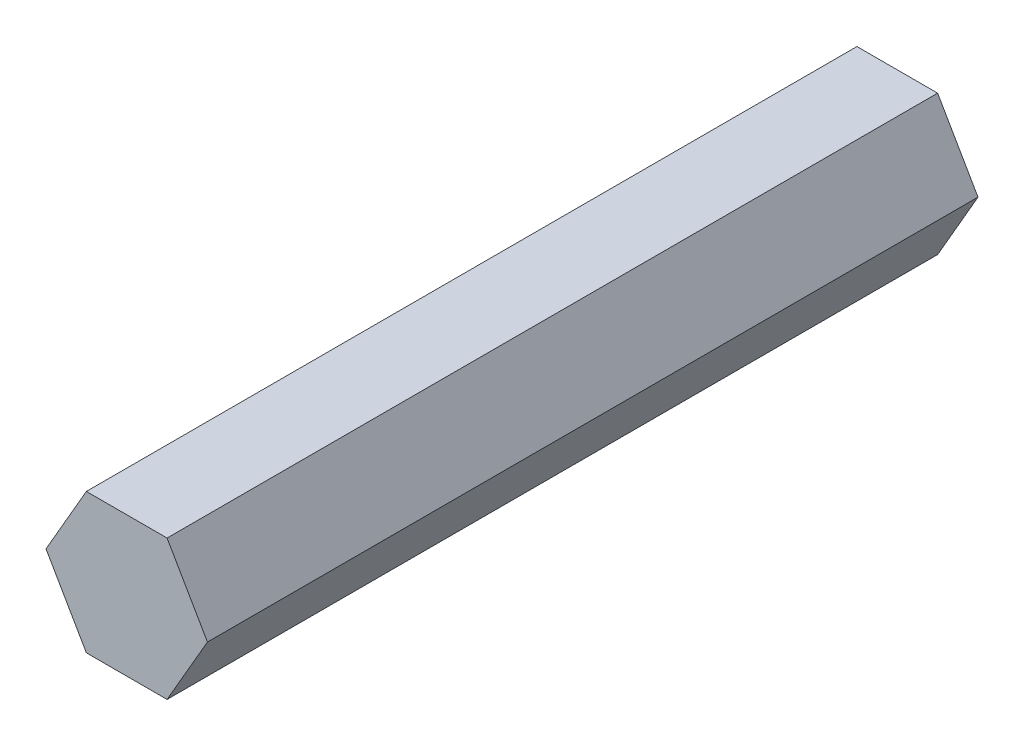
ISO-10303-21;
HEADER;
FILE_DESCRIPTION(('STEP AP214'),'2;1');
FILE_NAME('part.step','',(''),(''),'','','');
FILE_SCHEMA(('AUTOMOTIVE_DESIGN { 1 0 10303 214 1 1 1 1 }'));
ENDSEC;
DATA;
#1=APPLICATION_CONTEXT('core data for automotive mechanical design processes');
#2=APPLICATION_PROTOCOL_DEFINITION('international standard','automotive_design',2000,#1);
#3=PRODUCT_CONTEXT('',#1,'mechanical');
#4=PRODUCT('Part','Part','',(#3));
#5=PRODUCT_RELATED_PRODUCT_CATEGORY('part','',(#4));
#6=PRODUCT_DEFINITION_FORMATION('','',#4);
#7=PRODUCT_DEFINITION_CONTEXT('part definition',#1,'design');
#8=PRODUCT_DEFINITION('design','',#6,#7);
#9=PRODUCT_DEFINITION_SHAPE('','',#8);
#10=(LENGTH_UNIT() NAMED_UNIT(*) SI_UNIT(.MILLI.,.METRE.));
#11=(NAMED_UNIT(*) PLANE_ANGLE_UNIT() SI_UNIT($,.RADIAN.));
#12=(NAMED_UNIT(*) SI_UNIT($,.STERADIAN.) SOLID_ANGLE_UNIT());
#13=UNCERTAINTY_MEASURE_WITH_UNIT(LENGTH_MEASURE(1.E-05),#10,'distance_accuracy_value','');
#14=(GEOMETRIC_REPRESENTATION_CONTEXT(3) GLOBAL_UNCERTAINTY_ASSIGNED_CONTEXT((#13)) GLOBAL_UNIT_ASSIGNED_CONTEXT((#10,
#11,#12)) REPRESENTATION_CONTEXT('',''));
#15=CARTESIAN_POINT('',(0.,0.,0.));
#16=DIRECTION('',(0.,0.,1.));
#17=DIRECTION('',(1.,0.,0.));
#18=AXIS2_PLACEMENT_3D('',#15,#16,#17);
#19=CARTESIAN_POINT('',(3.6661742093542,-6.34999999999996,70.));
#20=DIRECTION('',(-0.866025403784441,0.499999999999995,0.));
#21=DIRECTION('',(-0.499999999999995,-0.866025403784441,0.));
#22=AXIS2_PLACEMENT_3D('',#19,#20,#21);
#23=PLANE('',#22);
#24=DIRECTION('',(0.499999999999995,0.866025403784441,0.));
#25=VECTOR('',#24,1.);
#26=CARTESIAN_POINT('',(3.6661742093542,-6.34999999999996,0.));
#27=LINE('',#26,#25);
#28=CARTESIAN_POINT('',(3.6661742093542,-6.34999999999996,0.));
#29=VERTEX_POINT('',#28);
#30=CARTESIAN_POINT('',(7.33234841870825,0.,0.));
#31=VERTEX_POINT('',#30);
#32=EDGE_CURVE('E124',#29,#31,#27,.T.);
#33=ORIENTED_EDGE('',*,*,#32,.T.);
#34=DIRECTION('',(0.,0.,-1.));
#35=VECTOR('',#34,1.);
#36=CARTESIAN_POINT('',(7.33234841870825,0.,70.));
#37=LINE('',#36,#35);
#38=CARTESIAN_POINT('',(7.33234841870825,0.,70.));
#39=VERTEX_POINT('',#38);
#40=EDGE_CURVE('E11',#39,#31,#37,.T.);
#41=ORIENTED_EDGE('',*,*,#40,.F.);
#42=DIRECTION('',(0.499999999999995,0.866025403784441,0.));
#43=VECTOR('',#42,1.);
#44=CARTESIAN_POINT('',(3.6661742093542,-6.34999999999996,70.));
#45=LINE('',#44,#43);
#46=CARTESIAN_POINT('',(3.6661742093542,-6.34999999999996,70.));
#47=VERTEX_POINT('',#46);
#48=EDGE_CURVE('E134',#47,#39,#45,.T.);
#49=ORIENTED_EDGE('',*,*,#48,.F.);
#50=DIRECTION('',(0.,0.,-1.));
#51=VECTOR('',#50,1.);
#52=CARTESIAN_POINT('',(3.6661742093542,-6.34999999999996,70.));
#53=LINE('',#52,#51);
#54=EDGE_CURVE('E116',#47,#29,#53,.T.);
#55=ORIENTED_EDGE('',*,*,#54,.T.);
#56=EDGE_LOOP('',(#33,#41,#49,#55));
#57=FACE_BOUND('',#56,.T.);
#58=ADVANCED_FACE('F39',(#57),#23,.F.);
#59=CARTESIAN_POINT('',(7.33234841870825,0.,70.));
#60=DIRECTION('',(-0.866025403784438,-0.500000000000001,0.));
#61=DIRECTION('',(0.500000000000001,-0.866025403784438,0.));
#62=AXIS2_PLACEMENT_3D('',#59,#60,#61);
#63=PLANE('',#62);
#64=DIRECTION('',(-0.500000000000001,0.866025403784438,0.));
#65=VECTOR('',#64,1.);
#66=CARTESIAN_POINT('',(7.33234841870825,0.,0.));
#67=LINE('',#66,#65);
#68=CARTESIAN_POINT('',(3.66617420935411,6.35000000000001,0.));
#69=VERTEX_POINT('',#68);
#70=EDGE_CURVE('E127',#31,#69,#67,.T.);
#71=ORIENTED_EDGE('',*,*,#70,.T.);
#72=DIRECTION('',(0.,0.,-1.));
#73=VECTOR('',#72,1.);
#74=CARTESIAN_POINT('',(3.66617420935411,6.35000000000001,70.));
#75=LINE('',#74,#73);
#76=CARTESIAN_POINT('',(3.66617420935411,6.35000000000001,70.));
#77=VERTEX_POINT('',#76);
#78=EDGE_CURVE('E50',#77,#69,#75,.T.);
#79=ORIENTED_EDGE('',*,*,#78,.F.);
#80=DIRECTION('',(-0.500000000000001,0.866025403784438,0.));
#81=VECTOR('',#80,1.);
#82=CARTESIAN_POINT('',(7.33234841870825,0.,70.));
#83=LINE('',#82,#81);
#84=EDGE_CURVE('E95',#39,#77,#83,.T.);
#85=ORIENTED_EDGE('',*,*,#84,.F.);
#86=ORIENTED_EDGE('',*,*,#40,.T.);
#87=EDGE_LOOP('',(#71,#79,#85,#86));
#88=FACE_BOUND('',#87,.T.);
#89=ADVANCED_FACE('F160',(#88),#63,.F.);
#90=CARTESIAN_POINT('',(3.66617420935411,6.35000000000001,70.));
#91=DIRECTION('',(0.,-1.,0.));
#92=DIRECTION('',(1.,0.,0.));
#93=AXIS2_PLACEMENT_3D('',#90,#91,#92);
#94=PLANE('',#93);
#95=DIRECTION('',(-1.,0.,0.));
#96=VECTOR('',#95,1.);
#97=CARTESIAN_POINT('',(3.66617420935411,6.35000000000001,0.));
#98=LINE('',#97,#96);
#99=CARTESIAN_POINT('',(-3.66617420935416,6.34999999999999,0.));
#100=VERTEX_POINT('',#99);
#101=EDGE_CURVE('E126',#69,#100,#98,.T.);
#102=ORIENTED_EDGE('',*,*,#101,.T.);
#103=DIRECTION('',(0.,0.,-1.));
#104=VECTOR('',#103,1.);
#105=CARTESIAN_POINT('',(-3.66617420935416,6.34999999999999,70.));
#106=LINE('',#105,#104);
#107=CARTESIAN_POINT('',(-3.66617420935416,6.34999999999999,70.));
#108=VERTEX_POINT('',#107);
#109=EDGE_CURVE('E111',#108,#100,#106,.T.);
#110=ORIENTED_EDGE('',*,*,#109,.F.);
#111=DIRECTION('',(-1.,0.,0.));
#112=VECTOR('',#111,1.);
#113=CARTESIAN_POINT('',(3.66617420935411,6.35000000000001,70.));
#114=LINE('',#113,#112);
#115=EDGE_CURVE('E104',#77,#108,#114,.T.);
#116=ORIENTED_EDGE('',*,*,#115,.F.);
#117=ORIENTED_EDGE('',*,*,#78,.T.);
#118=EDGE_LOOP('',(#102,#110,#116,#117));
#119=FACE_BOUND('',#118,.T.);
#120=ADVANCED_FACE('F138',(#119),#94,.F.);
#121=CARTESIAN_POINT('',(-3.66617420935416,6.34999999999999,70.));
#122=DIRECTION('',(0.866025403784442,-0.499999999999995,0.));
#123=DIRECTION('',(0.499999999999995,0.866025403784442,0.));
#124=AXIS2_PLACEMENT_3D('',#121,#122,#123);
#125=PLANE('',#124);
#126=DIRECTION('',(-0.499999999999995,-0.866025403784441,0.));
#127=VECTOR('',#126,1.);
#128=CARTESIAN_POINT('',(-3.66617420935416,6.34999999999999,0.));
#129=LINE('',#128,#127);
#130=CARTESIAN_POINT('',(-7.33234841870825,0.,0.));
#131=VERTEX_POINT('',#130);
#132=EDGE_CURVE('E114',#100,#131,#129,.T.);
#133=ORIENTED_EDGE('',*,*,#132,.T.);
#134=DIRECTION('',(0.,0.,-1.));
#135=VECTOR('',#134,1.);
#136=CARTESIAN_POINT('',(-7.33234841870825,0.,70.));
#137=LINE('',#136,#135);
#138=CARTESIAN_POINT('',(-7.33234841870825,0.,70.));
#139=VERTEX_POINT('',#138);
#140=EDGE_CURVE('E109',#139,#131,#137,.T.);
#141=ORIENTED_EDGE('',*,*,#140,.F.);
#142=DIRECTION('',(-0.499999999999995,-0.866025403784441,0.));
#143=VECTOR('',#142,1.);
#144=CARTESIAN_POINT('',(-3.66617420935416,6.34999999999999,70.));
#145=LINE('',#144,#143);
#146=EDGE_CURVE('E97',#108,#139,#145,.T.);
#147=ORIENTED_EDGE('',*,*,#146,.F.);
#148=ORIENTED_EDGE('',*,*,#109,.T.);
#149=EDGE_LOOP('',(#133,#141,#147,#148));
#150=FACE_BOUND('',#149,.T.);
#151=ADVANCED_FACE('F112',(#150),#125,.F.);
#152=CARTESIAN_POINT('',(-7.33234841870825,0.,70.));
#153=DIRECTION('',(0.866025403784435,0.500000000000007,0.));
#154=DIRECTION('',(-0.500000000000007,0.866025403784434,0.));
#155=AXIS2_PLACEMENT_3D('',#152,#153,#154);
#156=PLANE('',#155);
#157=DIRECTION('',(0.500000000000007,-0.866025403784435,0.));
#158=VECTOR('',#157,1.);
#159=CARTESIAN_POINT('',(-7.33234841870825,0.,0.));
#160=LINE('',#159,#158);
#161=CARTESIAN_POINT('',(-3.66617420935407,-6.35000000000004,0.));
#162=VERTEX_POINT('',#161);
#163=EDGE_CURVE('E79',#131,#162,#160,.T.);
#164=ORIENTED_EDGE('',*,*,#163,.T.);
#165=DIRECTION('',(0.,0.,-1.));
#166=VECTOR('',#165,1.);
#167=CARTESIAN_POINT('',(-3.66617420935407,-6.35000000000004,70.));
#168=LINE('',#167,#166);
#169=CARTESIAN_POINT('',(-3.66617420935407,-6.35000000000004,70.));
#170=VERTEX_POINT('',#169);
#171=EDGE_CURVE('E113',#170,#162,#168,.T.);
#172=ORIENTED_EDGE('',*,*,#171,.F.);
#173=DIRECTION('',(0.500000000000007,-0.866025403784435,0.));
#174=VECTOR('',#173,1.);
#175=CARTESIAN_POINT('',(-7.33234841870825,0.,70.));
#176=LINE('',#175,#174);
#177=EDGE_CURVE('E103',#139,#170,#176,.T.);
#178=ORIENTED_EDGE('',*,*,#177,.F.);
#179=ORIENTED_EDGE('',*,*,#140,.T.);
#180=EDGE_LOOP('',(#164,#172,#178,#179));
#181=FACE_BOUND('',#180,.T.);
#182=ADVANCED_FACE('F120',(#181),#156,.F.);
#183=CARTESIAN_POINT('',(-3.66617420935407,-6.35000000000004,70.));
#184=DIRECTION('',(0.,1.,0.));
#185=DIRECTION('',(-1.,0.,0.));
#186=AXIS2_PLACEMENT_3D('',#183,#184,#185);
#187=PLANE('',#186);
#188=DIRECTION('',(1.,0.,0.));
#189=VECTOR('',#188,1.);
#190=CARTESIAN_POINT('',(-3.66617420935407,-6.35000000000004,0.));
#191=LINE('',#190,#189);
#192=EDGE_CURVE('E83',#162,#29,#191,.T.);
#193=ORIENTED_EDGE('',*,*,#192,.T.);
#194=ORIENTED_EDGE('',*,*,#54,.F.);
#195=DIRECTION('',(1.,0.,0.));
#196=VECTOR('',#195,1.);
#197=CARTESIAN_POINT('',(-3.66617420935407,-6.35000000000004,70.));
#198=LINE('',#197,#196);
#199=EDGE_CURVE('E54',#170,#47,#198,.T.);
#200=ORIENTED_EDGE('',*,*,#199,.F.);
#201=ORIENTED_EDGE('',*,*,#171,.T.);
#202=EDGE_LOOP('',(#193,#194,#200,#201));
#203=FACE_BOUND('',#202,.T.);
#204=ADVANCED_FACE('F148',(#203),#187,.F.);
#205=CARTESIAN_POINT('',(0.,0.,70.));
#206=DIRECTION('',(0.,0.,1.));
#207=DIRECTION('',(1.,0.,0.));
#208=AXIS2_PLACEMENT_3D('',#205,#206,#207);
#209=PLANE('',#208);
#210=ORIENTED_EDGE('',*,*,#48,.T.);
#211=ORIENTED_EDGE('',*,*,#84,.T.);
#212=ORIENTED_EDGE('',*,*,#115,.T.);
#213=ORIENTED_EDGE('',*,*,#146,.T.);
#214=ORIENTED_EDGE('',*,*,#177,.T.);
#215=ORIENTED_EDGE('',*,*,#199,.T.);
#216=EDGE_LOOP('',(#210,#211,#212,#213,#214,#215));
#217=FACE_BOUND('',#216,.T.);
#218=ADVANCED_FACE('F101',(#217),#209,.T.);
#219=CARTESIAN_POINT('',(0.,0.,0.));
#220=DIRECTION('',(0.,0.,1.));
#221=DIRECTION('',(1.,0.,0.));
#222=AXIS2_PLACEMENT_3D('',#219,#220,#221);
#223=PLANE('',#222);
#224=ORIENTED_EDGE('',*,*,#32,.F.);
#225=ORIENTED_EDGE('',*,*,#192,.F.);
#226=ORIENTED_EDGE('',*,*,#163,.F.);
#227=ORIENTED_EDGE('',*,*,#132,.F.);
#228=ORIENTED_EDGE('',*,*,#101,.F.);
#229=ORIENTED_EDGE('',*,*,#70,.F.);
#230=EDGE_LOOP('',(#224,#225,#226,#227,#228,#229));
#231=FACE_BOUND('',#230,.T.);
#232=ADVANCED_FACE('F142',(#231),#223,.F.);
#233=CLOSED_SHELL('',(#58,#89,#120,#151,#182,#204,#218,#232));
#234=MANIFOLD_SOLID_BREP('B2',#233);
#235=ADVANCED_BREP_SHAPE_REPRESENTATION('',(#18,#234),#14);
#236=SHAPE_DEFINITION_REPRESENTATION(#9,#235);
ENDSEC;
END-ISO-10303-21;
